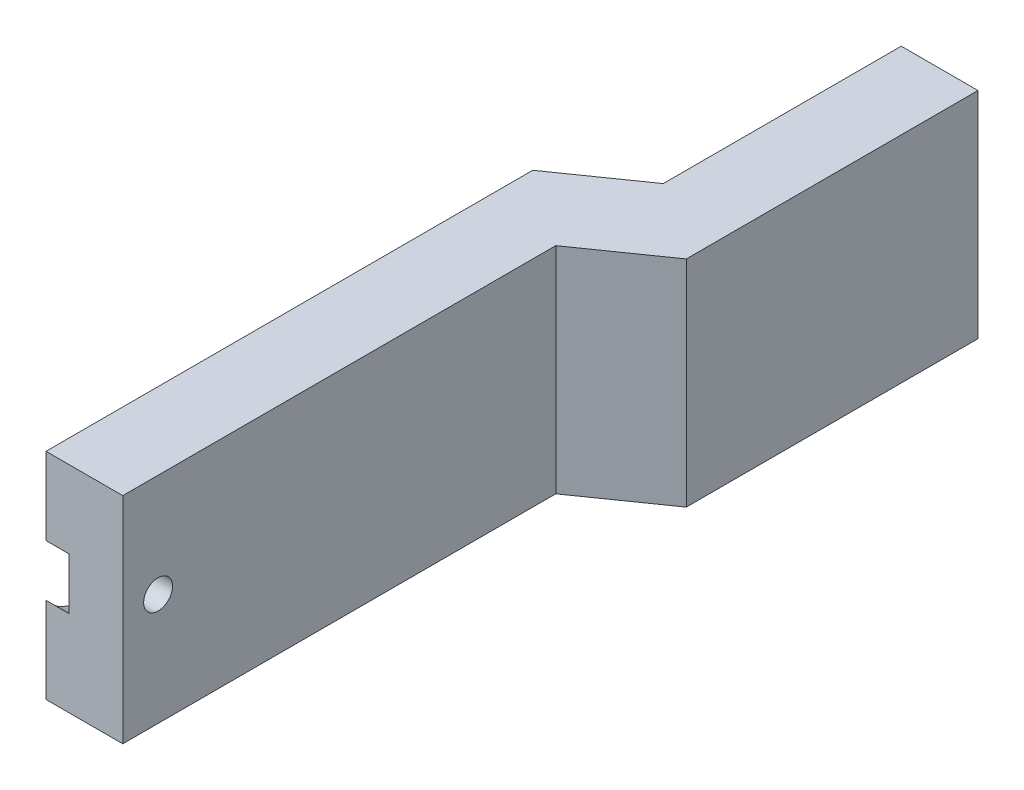
ISO-10303-21;
HEADER;
FILE_DESCRIPTION(('STEP AP214'),'2;1');
FILE_NAME('part.step','',(''),(''),'','','');
FILE_SCHEMA(('AUTOMOTIVE_DESIGN { 1 0 10303 214 1 1 1 1 }'));
ENDSEC;
DATA;
#1=APPLICATION_CONTEXT('core data for automotive mechanical design processes');
#2=APPLICATION_PROTOCOL_DEFINITION('international standard','automotive_design',2000,#1);
#3=PRODUCT_CONTEXT('',#1,'mechanical');
#4=PRODUCT('Part','Part','',(#3));
#5=PRODUCT_RELATED_PRODUCT_CATEGORY('part','',(#4));
#6=PRODUCT_DEFINITION_FORMATION('','',#4);
#7=PRODUCT_DEFINITION_CONTEXT('part definition',#1,'design');
#8=PRODUCT_DEFINITION('design','',#6,#7);
#9=PRODUCT_DEFINITION_SHAPE('','',#8);
#10=(LENGTH_UNIT() NAMED_UNIT(*) SI_UNIT(.MILLI.,.METRE.));
#11=(NAMED_UNIT(*) PLANE_ANGLE_UNIT() SI_UNIT($,.RADIAN.));
#12=(NAMED_UNIT(*) SI_UNIT($,.STERADIAN.) SOLID_ANGLE_UNIT());
#13=UNCERTAINTY_MEASURE_WITH_UNIT(LENGTH_MEASURE(1.E-05),#10,'distance_accuracy_value','');
#14=(GEOMETRIC_REPRESENTATION_CONTEXT(3) GLOBAL_UNCERTAINTY_ASSIGNED_CONTEXT((#13)) GLOBAL_UNIT_ASSIGNED_CONTEXT((#10,
#11,#12)) REPRESENTATION_CONTEXT('',''));
#15=CARTESIAN_POINT('',(0.,0.,0.));
#16=DIRECTION('',(0.,0.,1.));
#17=DIRECTION('',(1.,0.,0.));
#18=AXIS2_PLACEMENT_3D('',#15,#16,#17);
#19=CARTESIAN_POINT('',(0.,14.,0.));
#20=DIRECTION('',(1.,0.,0.));
#21=DIRECTION('',(0.,0.,-1.));
#22=AXIS2_PLACEMENT_3D('',#19,#20,#21);
#23=PLANE('',#22);
#24=DIRECTION('',(0.,-1.,0.));
#25=VECTOR('',#24,1.);
#26=CARTESIAN_POINT('',(0.,14.,0.));
#27=LINE('',#26,#25);
#28=CARTESIAN_POINT('',(0.,5.59699673202932,0.));
#29=VERTEX_POINT('',#28);
#30=CARTESIAN_POINT('',(0.,0.,0.));
#31=VERTEX_POINT('',#30);
#32=EDGE_CURVE('E172',#29,#31,#27,.T.);
#33=ORIENTED_EDGE('',*,*,#32,.F.);
#34=CARTESIAN_POINT('',(0.,7.28,-2.3));
#35=DIRECTION('',(-1.,0.,0.));
#36=DIRECTION('',(0.,0.,1.));
#37=AXIS2_PLACEMENT_3D('',#34,#35,#36);
#38=CIRCLE('',#37,2.85);
#39=CARTESIAN_POINT('',(0.,8.96300326797069,0.));
#40=VERTEX_POINT('',#39);
#41=EDGE_CURVE('E187',#40,#29,#38,.T.);
#42=ORIENTED_EDGE('',*,*,#41,.F.);
#43=CARTESIAN_POINT('',(0.,14.,0.));
#44=VERTEX_POINT('',#43);
#45=EDGE_CURVE('E173',#44,#40,#27,.T.);
#46=ORIENTED_EDGE('',*,*,#45,.F.);
#47=DIRECTION('',(0.,0.,1.));
#48=VECTOR('',#47,1.);
#49=CARTESIAN_POINT('',(0.,14.,0.));
#50=LINE('',#49,#48);
#51=CARTESIAN_POINT('',(0.,14.,-31.7));
#52=VERTEX_POINT('',#51);
#53=EDGE_CURVE('E159',#52,#44,#50,.T.);
#54=ORIENTED_EDGE('',*,*,#53,.F.);
#55=DIRECTION('',(0.,-1.,0.));
#56=VECTOR('',#55,1.);
#57=CARTESIAN_POINT('',(0.,14.,-31.7));
#58=LINE('',#57,#56);
#59=CARTESIAN_POINT('',(0.,0.,-31.7));
#60=VERTEX_POINT('',#59);
#61=EDGE_CURVE('E139',#52,#60,#58,.T.);
#62=ORIENTED_EDGE('',*,*,#61,.T.);
#63=DIRECTION('',(0.,0.,1.));
#64=VECTOR('',#63,1.);
#65=CARTESIAN_POINT('',(0.,0.,0.));
#66=LINE('',#65,#64);
#67=EDGE_CURVE('E143',#60,#31,#66,.T.);
#68=ORIENTED_EDGE('',*,*,#67,.T.);
#69=EDGE_LOOP('',(#33,#42,#46,#54,#62,#68));
#70=FACE_BOUND('',#69,.T.);
#71=ADVANCED_FACE('F36',(#70),#23,.F.);
#72=CARTESIAN_POINT('',(0.,14.,0.));
#73=DIRECTION('',(0.,0.,-1.));
#74=DIRECTION('',(-1.,0.,0.));
#75=AXIS2_PLACEMENT_3D('',#72,#73,#74);
#76=PLANE('',#75);
#77=DIRECTION('',(0.,1.,0.));
#78=VECTOR('',#77,1.);
#79=CARTESIAN_POINT('',(1.5,14.,0.));
#80=LINE('',#79,#78);
#81=CARTESIAN_POINT('',(1.5,5.59699673202932,0.));
#82=VERTEX_POINT('',#81);
#83=CARTESIAN_POINT('',(1.5,8.96300326797069,0.));
#84=VERTEX_POINT('',#83);
#85=EDGE_CURVE('E175',#82,#84,#80,.T.);
#86=ORIENTED_EDGE('',*,*,#85,.F.);
#87=DIRECTION('',(-1.,0.,0.));
#88=VECTOR('',#87,1.);
#89=CARTESIAN_POINT('',(1.5,5.59699673202932,0.));
#90=LINE('',#89,#88);
#91=EDGE_CURVE('E11',#82,#29,#90,.T.);
#92=ORIENTED_EDGE('',*,*,#91,.T.);
#93=ORIENTED_EDGE('',*,*,#32,.T.);
#94=DIRECTION('',(1.,0.,0.));
#95=VECTOR('',#94,1.);
#96=CARTESIAN_POINT('',(0.,0.,0.));
#97=LINE('',#96,#95);
#98=CARTESIAN_POINT('',(5.,0.,0.));
#99=VERTEX_POINT('',#98);
#100=EDGE_CURVE('E146',#31,#99,#97,.T.);
#101=ORIENTED_EDGE('',*,*,#100,.T.);
#102=DIRECTION('',(0.,-1.,0.));
#103=VECTOR('',#102,1.);
#104=CARTESIAN_POINT('',(5.,14.,0.));
#105=LINE('',#104,#103);
#106=CARTESIAN_POINT('',(5.,14.,0.));
#107=VERTEX_POINT('',#106);
#108=EDGE_CURVE('E169',#107,#99,#105,.T.);
#109=ORIENTED_EDGE('',*,*,#108,.F.);
#110=DIRECTION('',(1.,0.,0.));
#111=VECTOR('',#110,1.);
#112=CARTESIAN_POINT('',(0.,14.,0.));
#113=LINE('',#112,#111);
#114=EDGE_CURVE('E100',#44,#107,#113,.T.);
#115=ORIENTED_EDGE('',*,*,#114,.F.);
#116=ORIENTED_EDGE('',*,*,#45,.T.);
#117=DIRECTION('',(-1.,0.,0.));
#118=VECTOR('',#117,1.);
#119=CARTESIAN_POINT('',(1.5,8.96300326797069,0.));
#120=LINE('',#119,#118);
#121=EDGE_CURVE('E43',#40,#84,#120,.F.);
#122=ORIENTED_EDGE('',*,*,#121,.T.);
#123=EDGE_LOOP('',(#86,#92,#93,#101,#109,#115,#116,#122));
#124=FACE_BOUND('',#123,.T.);
#125=ADVANCED_FACE('F179',(#124),#76,.F.);
#126=CARTESIAN_POINT('',(5.,14.,0.));
#127=DIRECTION('',(-1.,0.,0.));
#128=DIRECTION('',(0.,0.,1.));
#129=AXIS2_PLACEMENT_3D('',#126,#127,#128);
#130=PLANE('',#129);
#131=CARTESIAN_POINT('',(5.,7.28,-2.3));
#132=DIRECTION('',(-1.,0.,0.));
#133=DIRECTION('',(0.,0.,1.));
#134=AXIS2_PLACEMENT_3D('',#131,#132,#133);
#135=CIRCLE('',#134,0.94);
#136=CARTESIAN_POINT('',(5.,7.28,-1.36));
#137=VERTEX_POINT('',#136);
#138=EDGE_CURVE('E192',#137,#137,#135,.T.);
#139=ORIENTED_EDGE('',*,*,#138,.T.);
#140=EDGE_LOOP('',(#139));
#141=FACE_BOUND('',#140,.T.);
#142=DIRECTION('',(0.,0.,-1.));
#143=VECTOR('',#142,1.);
#144=CARTESIAN_POINT('',(5.,0.,0.));
#145=LINE('',#144,#143);
#146=CARTESIAN_POINT('',(5.,0.,-28.2));
#147=VERTEX_POINT('',#146);
#148=EDGE_CURVE('E149',#99,#147,#145,.T.);
#149=ORIENTED_EDGE('',*,*,#148,.T.);
#150=DIRECTION('',(0.,-1.,0.));
#151=VECTOR('',#150,1.);
#152=CARTESIAN_POINT('',(5.,14.,-28.2));
#153=LINE('',#152,#151);
#154=CARTESIAN_POINT('',(5.,14.,-28.2));
#155=VERTEX_POINT('',#154);
#156=EDGE_CURVE('E166',#155,#147,#153,.T.);
#157=ORIENTED_EDGE('',*,*,#156,.F.);
#158=DIRECTION('',(0.,0.,-1.));
#159=VECTOR('',#158,1.);
#160=CARTESIAN_POINT('',(5.,14.,0.));
#161=LINE('',#160,#159);
#162=EDGE_CURVE('E212',#107,#155,#161,.T.);
#163=ORIENTED_EDGE('',*,*,#162,.F.);
#164=ORIENTED_EDGE('',*,*,#108,.T.);
#165=EDGE_LOOP('',(#149,#157,#163,#164));
#166=FACE_BOUND('',#165,.T.);
#167=ADVANCED_FACE('F232',(#141,#166),#130,.F.);
#168=CARTESIAN_POINT('',(10.,14.,-31.7));
#169=DIRECTION('',(-0.573462344363328,0.,-0.81923192051904));
#170=DIRECTION('',(-0.819231920519041,0.,0.573462344363328));
#171=AXIS2_PLACEMENT_3D('',#168,#169,#170);
#172=PLANE('',#171);
#173=DIRECTION('',(0.819231920519041,0.,-0.573462344363328));
#174=VECTOR('',#173,1.);
#175=CARTESIAN_POINT('',(10.,0.,-31.7));
#176=LINE('',#175,#174);
#177=CARTESIAN_POINT('',(10.,0.,-31.7));
#178=VERTEX_POINT('',#177);
#179=EDGE_CURVE('E151',#147,#178,#176,.T.);
#180=ORIENTED_EDGE('',*,*,#179,.T.);
#181=DIRECTION('',(0.,-1.,0.));
#182=VECTOR('',#181,1.);
#183=CARTESIAN_POINT('',(10.,14.,-31.7));
#184=LINE('',#183,#182);
#185=CARTESIAN_POINT('',(10.,14.,-31.7));
#186=VERTEX_POINT('',#185);
#187=EDGE_CURVE('E163',#186,#178,#184,.T.);
#188=ORIENTED_EDGE('',*,*,#187,.F.);
#189=DIRECTION('',(0.819231920519041,0.,-0.573462344363328));
#190=VECTOR('',#189,1.);
#191=CARTESIAN_POINT('',(10.,14.,-31.7));
#192=LINE('',#191,#190);
#193=EDGE_CURVE('E214',#155,#186,#192,.T.);
#194=ORIENTED_EDGE('',*,*,#193,.F.);
#195=ORIENTED_EDGE('',*,*,#156,.T.);
#196=EDGE_LOOP('',(#180,#188,#194,#195));
#197=FACE_BOUND('',#196,.T.);
#198=ADVANCED_FACE('F220',(#197),#172,.F.);
#199=CARTESIAN_POINT('',(10.,14.,-50.7));
#200=DIRECTION('',(-1.,0.,0.));
#201=DIRECTION('',(0.,0.,1.));
#202=AXIS2_PLACEMENT_3D('',#199,#200,#201);
#203=PLANE('',#202);
#204=DIRECTION('',(0.,0.,-1.));
#205=VECTOR('',#204,1.);
#206=CARTESIAN_POINT('',(10.,0.,-50.7));
#207=LINE('',#206,#205);
#208=CARTESIAN_POINT('',(10.,0.,-50.7));
#209=VERTEX_POINT('',#208);
#210=EDGE_CURVE('E153',#178,#209,#207,.T.);
#211=ORIENTED_EDGE('',*,*,#210,.T.);
#212=DIRECTION('',(0.,-1.,0.));
#213=VECTOR('',#212,1.);
#214=CARTESIAN_POINT('',(10.,14.,-50.7));
#215=LINE('',#214,#213);
#216=CARTESIAN_POINT('',(10.,14.,-50.7));
#217=VERTEX_POINT('',#216);
#218=EDGE_CURVE('E134',#217,#209,#215,.T.);
#219=ORIENTED_EDGE('',*,*,#218,.F.);
#220=DIRECTION('',(0.,0.,-1.));
#221=VECTOR('',#220,1.);
#222=CARTESIAN_POINT('',(10.,14.,-50.7));
#223=LINE('',#222,#221);
#224=EDGE_CURVE('E122',#186,#217,#223,.T.);
#225=ORIENTED_EDGE('',*,*,#224,.F.);
#226=ORIENTED_EDGE('',*,*,#187,.T.);
#227=EDGE_LOOP('',(#211,#219,#225,#226));
#228=FACE_BOUND('',#227,.T.);
#229=ADVANCED_FACE('F224',(#228),#203,.F.);
#230=CARTESIAN_POINT('',(5.,14.,-50.7));
#231=DIRECTION('',(0.,0.,1.));
#232=DIRECTION('',(1.,0.,0.));
#233=AXIS2_PLACEMENT_3D('',#230,#231,#232);
#234=PLANE('',#233);
#235=DIRECTION('',(-1.,0.,0.));
#236=VECTOR('',#235,1.);
#237=CARTESIAN_POINT('',(5.,0.,-50.7));
#238=LINE('',#237,#236);
#239=CARTESIAN_POINT('',(5.,0.,-50.7));
#240=VERTEX_POINT('',#239);
#241=EDGE_CURVE('E131',#209,#240,#238,.T.);
#242=ORIENTED_EDGE('',*,*,#241,.T.);
#243=DIRECTION('',(0.,-1.,0.));
#244=VECTOR('',#243,1.);
#245=CARTESIAN_POINT('',(5.,14.,-50.7));
#246=LINE('',#245,#244);
#247=CARTESIAN_POINT('',(5.,14.,-50.7));
#248=VERTEX_POINT('',#247);
#249=EDGE_CURVE('E128',#248,#240,#246,.T.);
#250=ORIENTED_EDGE('',*,*,#249,.F.);
#251=DIRECTION('',(-1.,0.,0.));
#252=VECTOR('',#251,1.);
#253=CARTESIAN_POINT('',(5.,14.,-50.7));
#254=LINE('',#253,#252);
#255=EDGE_CURVE('E115',#217,#248,#254,.T.);
#256=ORIENTED_EDGE('',*,*,#255,.F.);
#257=ORIENTED_EDGE('',*,*,#218,.T.);
#258=EDGE_LOOP('',(#242,#250,#256,#257));
#259=FACE_BOUND('',#258,.T.);
#260=ADVANCED_FACE('F129',(#259),#234,.F.);
#261=CARTESIAN_POINT('',(5.,14.,-35.2));
#262=DIRECTION('',(1.,0.,0.));
#263=DIRECTION('',(0.,0.,-1.));
#264=AXIS2_PLACEMENT_3D('',#261,#262,#263);
#265=PLANE('',#264);
#266=DIRECTION('',(0.,0.,1.));
#267=VECTOR('',#266,1.);
#268=CARTESIAN_POINT('',(5.,0.,-35.2));
#269=LINE('',#268,#267);
#270=CARTESIAN_POINT('',(5.,0.,-35.2));
#271=VERTEX_POINT('',#270);
#272=EDGE_CURVE('E156',#240,#271,#269,.T.);
#273=ORIENTED_EDGE('',*,*,#272,.T.);
#274=DIRECTION('',(0.,-1.,0.));
#275=VECTOR('',#274,1.);
#276=CARTESIAN_POINT('',(5.,14.,-35.2));
#277=LINE('',#276,#275);
#278=CARTESIAN_POINT('',(5.,14.,-35.2));
#279=VERTEX_POINT('',#278);
#280=EDGE_CURVE('E135',#279,#271,#277,.T.);
#281=ORIENTED_EDGE('',*,*,#280,.F.);
#282=DIRECTION('',(0.,0.,1.));
#283=VECTOR('',#282,1.);
#284=CARTESIAN_POINT('',(5.,14.,-35.2));
#285=LINE('',#284,#283);
#286=EDGE_CURVE('E119',#248,#279,#285,.T.);
#287=ORIENTED_EDGE('',*,*,#286,.F.);
#288=ORIENTED_EDGE('',*,*,#249,.T.);
#289=EDGE_LOOP('',(#273,#281,#287,#288));
#290=FACE_BOUND('',#289,.T.);
#291=ADVANCED_FACE('F137',(#290),#265,.F.);
#292=CARTESIAN_POINT('',(5.,14.,-35.2));
#293=DIRECTION('',(0.573462344363329,0.,0.81923192051904));
#294=DIRECTION('',(0.81923192051904,0.,-0.573462344363329));
#295=AXIS2_PLACEMENT_3D('',#292,#293,#294);
#296=PLANE('',#295);
#297=DIRECTION('',(-0.81923192051904,0.,0.573462344363329));
#298=VECTOR('',#297,1.);
#299=CARTESIAN_POINT('',(5.,0.,-35.2));
#300=LINE('',#299,#298);
#301=EDGE_CURVE('E91',#271,#60,#300,.T.);
#302=ORIENTED_EDGE('',*,*,#301,.T.);
#303=ORIENTED_EDGE('',*,*,#61,.F.);
#304=DIRECTION('',(-0.81923192051904,0.,0.573462344363329));
#305=VECTOR('',#304,1.);
#306=CARTESIAN_POINT('',(5.,14.,-35.2));
#307=LINE('',#306,#305);
#308=EDGE_CURVE('E58',#279,#52,#307,.T.);
#309=ORIENTED_EDGE('',*,*,#308,.F.);
#310=ORIENTED_EDGE('',*,*,#280,.T.);
#311=EDGE_LOOP('',(#302,#303,#309,#310));
#312=FACE_BOUND('',#311,.T.);
#313=ADVANCED_FACE('F228',(#312),#296,.F.);
#314=CARTESIAN_POINT('',(0.,14.,0.));
#315=DIRECTION('',(0.,-1.,0.));
#316=DIRECTION('',(0.,0.,-1.));
#317=AXIS2_PLACEMENT_3D('',#314,#315,#316);
#318=PLANE('',#317);
#319=ORIENTED_EDGE('',*,*,#53,.T.);
#320=ORIENTED_EDGE('',*,*,#114,.T.);
#321=ORIENTED_EDGE('',*,*,#162,.T.);
#322=ORIENTED_EDGE('',*,*,#193,.T.);
#323=ORIENTED_EDGE('',*,*,#224,.T.);
#324=ORIENTED_EDGE('',*,*,#255,.T.);
#325=ORIENTED_EDGE('',*,*,#286,.T.);
#326=ORIENTED_EDGE('',*,*,#308,.T.);
#327=EDGE_LOOP('',(#319,#320,#321,#322,#323,#324,#325,#326));
#328=FACE_BOUND('',#327,.T.);
#329=ADVANCED_FACE('F117',(#328),#318,.F.);
#330=CARTESIAN_POINT('',(0.,0.,0.));
#331=DIRECTION('',(0.,-1.,0.));
#332=DIRECTION('',(0.,0.,-1.));
#333=AXIS2_PLACEMENT_3D('',#330,#331,#332);
#334=PLANE('',#333);
#335=CARTESIAN_POINT('',(2.5,0.,-4.7));
#336=DIRECTION('',(0.,-1.,0.));
#337=DIRECTION('',(0.,0.,-1.));
#338=AXIS2_PLACEMENT_3D('',#335,#336,#337);
#339=CIRCLE('',#338,1.);
#340=CARTESIAN_POINT('',(2.5,0.,-5.7));
#341=VERTEX_POINT('',#340);
#342=EDGE_CURVE('E202',#341,#341,#339,.T.);
#343=ORIENTED_EDGE('',*,*,#342,.F.);
#344=EDGE_LOOP('',(#343));
#345=FACE_BOUND('',#344,.T.);
#346=CARTESIAN_POINT('',(7.5,0.,-46.));
#347=DIRECTION('',(0.,-1.,0.));
#348=DIRECTION('',(0.,0.,-1.));
#349=AXIS2_PLACEMENT_3D('',#346,#347,#348);
#350=CIRCLE('',#349,1.);
#351=CARTESIAN_POINT('',(7.5,0.,-47.));
#352=VERTEX_POINT('',#351);
#353=EDGE_CURVE('E205',#352,#352,#350,.T.);
#354=ORIENTED_EDGE('',*,*,#353,.F.);
#355=EDGE_LOOP('',(#354));
#356=FACE_BOUND('',#355,.T.);
#357=ORIENTED_EDGE('',*,*,#67,.F.);
#358=ORIENTED_EDGE('',*,*,#301,.F.);
#359=ORIENTED_EDGE('',*,*,#272,.F.);
#360=ORIENTED_EDGE('',*,*,#241,.F.);
#361=ORIENTED_EDGE('',*,*,#210,.F.);
#362=ORIENTED_EDGE('',*,*,#179,.F.);
#363=ORIENTED_EDGE('',*,*,#148,.F.);
#364=ORIENTED_EDGE('',*,*,#100,.F.);
#365=EDGE_LOOP('',(#357,#358,#359,#360,#361,#362,#363,#364));
#366=FACE_BOUND('',#365,.T.);
#367=ADVANCED_FACE('F227',(#345,#356,#366),#334,.T.);
#368=CARTESIAN_POINT('',(7.5,5.,-46.));
#369=DIRECTION('',(0.,-1.,0.));
#370=DIRECTION('',(0.,0.,-1.));
#371=AXIS2_PLACEMENT_3D('',#368,#369,#370);
#372=CYLINDRICAL_SURFACE('',#371,1.);
#373=CARTESIAN_POINT('',(7.5,5.,-46.));
#374=DIRECTION('',(0.,-1.,0.));
#375=DIRECTION('',(0.,0.,-1.));
#376=AXIS2_PLACEMENT_3D('',#373,#374,#375);
#377=CIRCLE('',#376,1.);
#378=CARTESIAN_POINT('',(7.5,5.,-47.));
#379=VERTEX_POINT('',#378);
#380=EDGE_CURVE('E194',#379,#379,#377,.T.);
#381=ORIENTED_EDGE('',*,*,#380,.F.);
#382=EDGE_LOOP('',(#381));
#383=FACE_BOUND('',#382,.T.);
#384=ORIENTED_EDGE('',*,*,#353,.T.);
#385=EDGE_LOOP('',(#384));
#386=FACE_BOUND('',#385,.T.);
#387=ADVANCED_FACE('F312',(#383,#386),#372,.F.);
#388=CARTESIAN_POINT('',(7.5,5.,-46.));
#389=DIRECTION('',(0.,-1.,0.));
#390=DIRECTION('',(0.,0.,-1.));
#391=AXIS2_PLACEMENT_3D('',#388,#389,#390);
#392=PLANE('',#391);
#393=ORIENTED_EDGE('',*,*,#380,.T.);
#394=EDGE_LOOP('',(#393));
#395=FACE_BOUND('',#394,.T.);
#396=ADVANCED_FACE('F303',(#395),#392,.T.);
#397=CARTESIAN_POINT('',(2.5,5.,-4.7));
#398=DIRECTION('',(0.,-1.,0.));
#399=DIRECTION('',(0.,0.,-1.));
#400=AXIS2_PLACEMENT_3D('',#397,#398,#399);
#401=CYLINDRICAL_SURFACE('',#400,1.);
#402=CARTESIAN_POINT('',(2.5,5.,-4.7));
#403=DIRECTION('',(0.,-1.,0.));
#404=DIRECTION('',(0.,0.,-1.));
#405=AXIS2_PLACEMENT_3D('',#402,#403,#404);
#406=CIRCLE('',#405,1.);
#407=CARTESIAN_POINT('',(2.5,5.,-5.7));
#408=VERTEX_POINT('',#407);
#409=EDGE_CURVE('E147',#408,#408,#406,.T.);
#410=ORIENTED_EDGE('',*,*,#409,.F.);
#411=EDGE_LOOP('',(#410));
#412=FACE_BOUND('',#411,.T.);
#413=ORIENTED_EDGE('',*,*,#342,.T.);
#414=EDGE_LOOP('',(#413));
#415=FACE_BOUND('',#414,.T.);
#416=ADVANCED_FACE('F295',(#412,#415),#401,.F.);
#417=CARTESIAN_POINT('',(2.5,5.,-4.7));
#418=DIRECTION('',(0.,-1.,0.));
#419=DIRECTION('',(0.,0.,-1.));
#420=AXIS2_PLACEMENT_3D('',#417,#418,#419);
#421=PLANE('',#420);
#422=ORIENTED_EDGE('',*,*,#409,.T.);
#423=EDGE_LOOP('',(#422));
#424=FACE_BOUND('',#423,.T.);
#425=ADVANCED_FACE('F250',(#424),#421,.T.);
#426=CARTESIAN_POINT('',(1.5,7.28,-2.3));
#427=DIRECTION('',(-1.,0.,0.));
#428=DIRECTION('',(0.,0.,1.));
#429=AXIS2_PLACEMENT_3D('',#426,#427,#428);
#430=CYLINDRICAL_SURFACE('',#429,2.85);
#431=CARTESIAN_POINT('',(1.5,7.28,-2.3));
#432=DIRECTION('',(-1.,0.,0.));
#433=DIRECTION('',(0.,0.,1.));
#434=AXIS2_PLACEMENT_3D('',#431,#432,#433);
#435=CIRCLE('',#434,2.85);
#436=EDGE_CURVE('E49',#84,#82,#435,.T.);
#437=ORIENTED_EDGE('',*,*,#436,.F.);
#438=ORIENTED_EDGE('',*,*,#121,.F.);
#439=ORIENTED_EDGE('',*,*,#41,.T.);
#440=ORIENTED_EDGE('',*,*,#91,.F.);
#441=EDGE_LOOP('',(#437,#438,#439,#440));
#442=FACE_BOUND('',#441,.T.);
#443=ADVANCED_FACE('F186',(#442),#430,.F.);
#444=CARTESIAN_POINT('',(1.5,7.28,-2.3));
#445=DIRECTION('',(-1.,0.,0.));
#446=DIRECTION('',(0.,0.,1.));
#447=AXIS2_PLACEMENT_3D('',#444,#445,#446);
#448=PLANE('',#447);
#449=CARTESIAN_POINT('',(1.5,7.28,-2.3));
#450=DIRECTION('',(-1.,0.,0.));
#451=DIRECTION('',(0.,0.,1.));
#452=AXIS2_PLACEMENT_3D('',#449,#450,#451);
#453=CIRCLE('',#452,0.94);
#454=CARTESIAN_POINT('',(1.5,7.28,-1.36));
#455=VERTEX_POINT('',#454);
#456=EDGE_CURVE('E197',#455,#455,#453,.T.);
#457=ORIENTED_EDGE('',*,*,#456,.F.);
#458=EDGE_LOOP('',(#457));
#459=FACE_BOUND('',#458,.T.);
#460=ORIENTED_EDGE('',*,*,#85,.T.);
#461=ORIENTED_EDGE('',*,*,#436,.T.);
#462=EDGE_LOOP('',(#460,#461));
#463=FACE_BOUND('',#462,.T.);
#464=ADVANCED_FACE('F261',(#459,#463),#448,.T.);
#465=CARTESIAN_POINT('',(10.,7.28,-2.3));
#466=DIRECTION('',(-1.,0.,0.));
#467=DIRECTION('',(0.,0.,1.));
#468=AXIS2_PLACEMENT_3D('',#465,#466,#467);
#469=CYLINDRICAL_SURFACE('',#468,0.94);
#470=ORIENTED_EDGE('',*,*,#456,.T.);
#471=EDGE_LOOP('',(#470));
#472=FACE_BOUND('',#471,.T.);
#473=ORIENTED_EDGE('',*,*,#138,.F.);
#474=EDGE_LOOP('',(#473));
#475=FACE_BOUND('',#474,.T.);
#476=ADVANCED_FACE('F273',(#472,#475),#469,.F.);
#477=CLOSED_SHELL('',(#71,#125,#167,#198,#229,#260,#291,#313,#329,#367,#387,#396,#416,#425,#443,
#464,#476));
#478=MANIFOLD_SOLID_BREP('B2',#477);
#479=ADVANCED_BREP_SHAPE_REPRESENTATION('',(#18,#478),#14);
#480=SHAPE_DEFINITION_REPRESENTATION(#9,#479);
ENDSEC;
END-ISO-10303-21;
